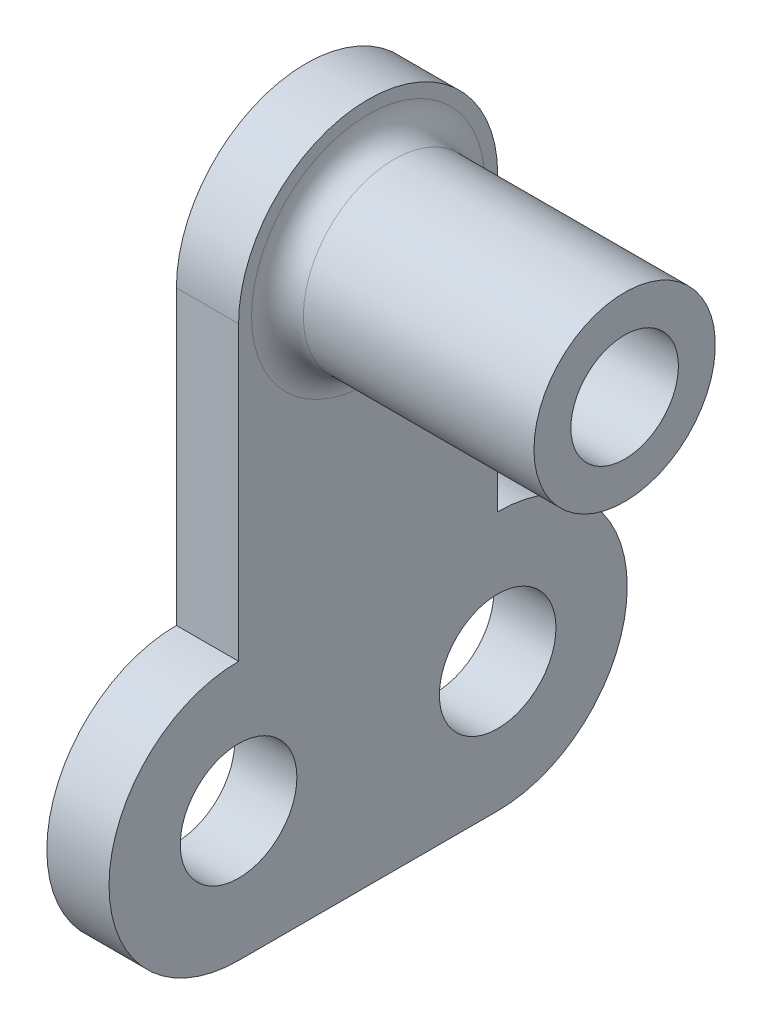
ISO-10303-21;
HEADER;
FILE_DESCRIPTION(('STEP AP214'),'2;1');
FILE_NAME('part.step','',(''),(''),'','','');
FILE_SCHEMA(('AUTOMOTIVE_DESIGN { 1 0 10303 214 1 1 1 1 }'));
ENDSEC;
DATA;
#1=APPLICATION_CONTEXT('core data for automotive mechanical design processes');
#2=APPLICATION_PROTOCOL_DEFINITION('international standard','automotive_design',2000,#1);
#3=PRODUCT_CONTEXT('',#1,'mechanical');
#4=PRODUCT('Part','Part','',(#3));
#5=PRODUCT_RELATED_PRODUCT_CATEGORY('part','',(#4));
#6=PRODUCT_DEFINITION_FORMATION('','',#4);
#7=PRODUCT_DEFINITION_CONTEXT('part definition',#1,'design');
#8=PRODUCT_DEFINITION('design','',#6,#7);
#9=PRODUCT_DEFINITION_SHAPE('','',#8);
#10=(LENGTH_UNIT() NAMED_UNIT(*) SI_UNIT(.MILLI.,.METRE.));
#11=(NAMED_UNIT(*) PLANE_ANGLE_UNIT() SI_UNIT($,.RADIAN.));
#12=(NAMED_UNIT(*) SI_UNIT($,.STERADIAN.) SOLID_ANGLE_UNIT());
#13=UNCERTAINTY_MEASURE_WITH_UNIT(LENGTH_MEASURE(1.E-05),#10,'distance_accuracy_value','');
#14=(GEOMETRIC_REPRESENTATION_CONTEXT(3) GLOBAL_UNCERTAINTY_ASSIGNED_CONTEXT((#13)) GLOBAL_UNIT_ASSIGNED_CONTEXT((#10,
#11,#12)) REPRESENTATION_CONTEXT('',''));
#15=CARTESIAN_POINT('',(0.,0.,0.));
#16=DIRECTION('',(0.,0.,1.));
#17=DIRECTION('',(1.,0.,0.));
#18=AXIS2_PLACEMENT_3D('',#15,#16,#17);
#19=CARTESIAN_POINT('',(2.4,21.2821563056051,0.));
#20=DIRECTION('',(-1.,0.,0.));
#21=DIRECTION('',(0.,0.,1.));
#22=AXIS2_PLACEMENT_3D('',#19,#20,#21);
#23=CYLINDRICAL_SURFACE('',#22,2.075);
#24=CARTESIAN_POINT('',(12.3,21.2821563056051,0.));
#25=DIRECTION('',(1.,0.,0.));
#26=DIRECTION('',(0.,0.,-1.));
#27=AXIS2_PLACEMENT_3D('',#24,#25,#26);
#28=CIRCLE('',#27,2.075);
#29=CARTESIAN_POINT('',(12.3,21.2821563056051,-2.075));
#30=VERTEX_POINT('',#29);
#31=EDGE_CURVE('E224',#30,#30,#28,.T.);
#32=ORIENTED_EDGE('',*,*,#31,.T.);
#33=EDGE_LOOP('',(#32));
#34=FACE_BOUND('',#33,.T.);
#35=CARTESIAN_POINT('',(4.,21.2821563056051,0.));
#36=DIRECTION('',(-1.,0.,0.));
#37=DIRECTION('',(0.,0.,1.));
#38=AXIS2_PLACEMENT_3D('',#35,#36,#37);
#39=CIRCLE('',#38,2.075);
#40=CARTESIAN_POINT('',(4.,21.2821563056051,2.075));
#41=VERTEX_POINT('',#40);
#42=EDGE_CURVE('E228',#41,#41,#39,.T.);
#43=ORIENTED_EDGE('',*,*,#42,.T.);
#44=EDGE_LOOP('',(#43));
#45=FACE_BOUND('',#44,.T.);
#46=ADVANCED_FACE('F41',(#34,#45),#23,.F.);
#47=CARTESIAN_POINT('',(2.4,5.,5.));
#48=DIRECTION('',(1.,0.,0.));
#49=DIRECTION('',(0.,0.,-1.));
#50=AXIS2_PLACEMENT_3D('',#47,#48,#49);
#51=PLANE('',#50);
#52=CARTESIAN_POINT('',(2.4,21.2821563056051,0.));
#53=DIRECTION('',(1.,0.,0.));
#54=DIRECTION('',(0.,0.,-1.));
#55=AXIS2_PLACEMENT_3D('',#52,#53,#54);
#56=CIRCLE('',#55,4.5);
#57=CARTESIAN_POINT('',(2.4,21.2821563056051,-4.5));
#58=VERTEX_POINT('',#57);
#59=EDGE_CURVE('E11',#58,#58,#56,.F.);
#60=ORIENTED_EDGE('',*,*,#59,.T.);
#61=EDGE_LOOP('',(#60));
#62=FACE_BOUND('',#61,.T.);
#63=CARTESIAN_POINT('',(2.4,5.,-5.));
#64=DIRECTION('',(1.,0.,0.));
#65=DIRECTION('',(0.,0.,-1.));
#66=AXIS2_PLACEMENT_3D('',#63,#64,#65);
#67=CIRCLE('',#66,2.25);
#68=CARTESIAN_POINT('',(2.4,5.,-7.25));
#69=VERTEX_POINT('',#68);
#70=EDGE_CURVE('E212',#69,#69,#67,.T.);
#71=ORIENTED_EDGE('',*,*,#70,.F.);
#72=EDGE_LOOP('',(#71));
#73=FACE_BOUND('',#72,.T.);
#74=CARTESIAN_POINT('',(2.4,5.,5.));
#75=DIRECTION('',(1.,0.,0.));
#76=DIRECTION('',(0.,0.,-1.));
#77=AXIS2_PLACEMENT_3D('',#74,#75,#76);
#78=CIRCLE('',#77,5.);
#79=CARTESIAN_POINT('',(2.4,10.,5.));
#80=VERTEX_POINT('',#79);
#81=CARTESIAN_POINT('',(2.4,0.,5.));
#82=VERTEX_POINT('',#81);
#83=EDGE_CURVE('E139',#80,#82,#78,.T.);
#84=ORIENTED_EDGE('',*,*,#83,.T.);
#85=DIRECTION('',(0.,0.,-1.));
#86=VECTOR('',#85,1.);
#87=CARTESIAN_POINT('',(2.4,0.,5.));
#88=LINE('',#87,#86);
#89=CARTESIAN_POINT('',(2.4,0.,-5.));
#90=VERTEX_POINT('',#89);
#91=EDGE_CURVE('E98',#82,#90,#88,.T.);
#92=ORIENTED_EDGE('',*,*,#91,.T.);
#93=CARTESIAN_POINT('',(2.4,5.,-5.));
#94=DIRECTION('',(1.,0.,0.));
#95=DIRECTION('',(0.,0.,-1.));
#96=AXIS2_PLACEMENT_3D('',#93,#94,#95);
#97=CIRCLE('',#96,5.);
#98=CARTESIAN_POINT('',(2.4,10.,-5.));
#99=VERTEX_POINT('',#98);
#100=EDGE_CURVE('E109',#90,#99,#97,.T.);
#101=ORIENTED_EDGE('',*,*,#100,.T.);
#102=DIRECTION('',(0.,1.,0.));
#103=VECTOR('',#102,1.);
#104=CARTESIAN_POINT('',(2.4,10.,-5.));
#105=LINE('',#104,#103);
#106=CARTESIAN_POINT('',(2.4,21.2821563056051,-5.));
#107=VERTEX_POINT('',#106);
#108=EDGE_CURVE('E101',#99,#107,#105,.T.);
#109=ORIENTED_EDGE('',*,*,#108,.T.);
#110=CARTESIAN_POINT('',(2.4,21.2821563056051,0.));
#111=DIRECTION('',(1.,0.,0.));
#112=DIRECTION('',(0.,0.,1.));
#113=AXIS2_PLACEMENT_3D('',#110,#111,#112);
#114=CIRCLE('',#113,5.);
#115=CARTESIAN_POINT('',(2.4,21.2821563056051,5.));
#116=VERTEX_POINT('',#115);
#117=EDGE_CURVE('E108',#107,#116,#114,.T.);
#118=ORIENTED_EDGE('',*,*,#117,.T.);
#119=DIRECTION('',(0.,-1.,0.));
#120=VECTOR('',#119,1.);
#121=CARTESIAN_POINT('',(2.4,10.,5.));
#122=LINE('',#121,#120);
#123=EDGE_CURVE('E59',#116,#80,#122,.T.);
#124=ORIENTED_EDGE('',*,*,#123,.T.);
#125=EDGE_LOOP('',(#84,#92,#101,#109,#118,#124));
#126=FACE_BOUND('',#125,.T.);
#127=CARTESIAN_POINT('',(2.4,5.,5.));
#128=DIRECTION('',(1.,0.,0.));
#129=DIRECTION('',(0.,0.,-1.));
#130=AXIS2_PLACEMENT_3D('',#127,#128,#129);
#131=CIRCLE('',#130,2.25);
#132=CARTESIAN_POINT('',(2.4,5.,2.75));
#133=VERTEX_POINT('',#132);
#134=EDGE_CURVE('E132',#133,#133,#131,.T.);
#135=ORIENTED_EDGE('',*,*,#134,.F.);
#136=EDGE_LOOP('',(#135));
#137=FACE_BOUND('',#136,.T.);
#138=ADVANCED_FACE('F102',(#62,#73,#126,#137),#51,.T.);
#139=CARTESIAN_POINT('',(0.,5.,5.));
#140=DIRECTION('',(1.,0.,0.));
#141=DIRECTION('',(0.,0.,-1.));
#142=AXIS2_PLACEMENT_3D('',#139,#140,#141);
#143=PLANE('',#142);
#144=CARTESIAN_POINT('',(0.,5.,5.));
#145=DIRECTION('',(1.,0.,0.));
#146=DIRECTION('',(0.,0.,-1.));
#147=AXIS2_PLACEMENT_3D('',#144,#145,#146);
#148=CIRCLE('',#147,5.);
#149=CARTESIAN_POINT('',(0.,10.,5.));
#150=VERTEX_POINT('',#149);
#151=CARTESIAN_POINT('',(0.,0.,5.));
#152=VERTEX_POINT('',#151);
#153=EDGE_CURVE('E127',#150,#152,#148,.T.);
#154=ORIENTED_EDGE('',*,*,#153,.F.);
#155=DIRECTION('',(0.,-1.,0.));
#156=VECTOR('',#155,1.);
#157=CARTESIAN_POINT('',(0.,10.,5.));
#158=LINE('',#157,#156);
#159=CARTESIAN_POINT('',(0.,21.2821563056051,5.));
#160=VERTEX_POINT('',#159);
#161=EDGE_CURVE('E87',#160,#150,#158,.T.);
#162=ORIENTED_EDGE('',*,*,#161,.F.);
#163=CARTESIAN_POINT('',(0.,21.2821563056051,0.));
#164=DIRECTION('',(1.,0.,0.));
#165=DIRECTION('',(0.,0.,1.));
#166=AXIS2_PLACEMENT_3D('',#163,#164,#165);
#167=CIRCLE('',#166,5.);
#168=CARTESIAN_POINT('',(0.,21.2821563056051,-5.));
#169=VERTEX_POINT('',#168);
#170=EDGE_CURVE('E83',#169,#160,#167,.T.);
#171=ORIENTED_EDGE('',*,*,#170,.F.);
#172=DIRECTION('',(0.,1.,0.));
#173=VECTOR('',#172,1.);
#174=CARTESIAN_POINT('',(0.,10.,-5.));
#175=LINE('',#174,#173);
#176=CARTESIAN_POINT('',(0.,10.,-5.));
#177=VERTEX_POINT('',#176);
#178=EDGE_CURVE('E117',#177,#169,#175,.T.);
#179=ORIENTED_EDGE('',*,*,#178,.F.);
#180=CARTESIAN_POINT('',(0.,5.,-5.));
#181=DIRECTION('',(1.,0.,0.));
#182=DIRECTION('',(0.,0.,-1.));
#183=AXIS2_PLACEMENT_3D('',#180,#181,#182);
#184=CIRCLE('',#183,5.);
#185=CARTESIAN_POINT('',(0.,0.,-5.));
#186=VERTEX_POINT('',#185);
#187=EDGE_CURVE('E133',#186,#177,#184,.T.);
#188=ORIENTED_EDGE('',*,*,#187,.F.);
#189=DIRECTION('',(0.,0.,-1.));
#190=VECTOR('',#189,1.);
#191=CARTESIAN_POINT('',(0.,0.,5.));
#192=LINE('',#191,#190);
#193=EDGE_CURVE('E131',#152,#186,#192,.T.);
#194=ORIENTED_EDGE('',*,*,#193,.F.);
#195=EDGE_LOOP('',(#154,#162,#171,#179,#188,#194));
#196=FACE_BOUND('',#195,.T.);
#197=CARTESIAN_POINT('',(0.,5.,5.));
#198=DIRECTION('',(1.,0.,0.));
#199=DIRECTION('',(0.,0.,-1.));
#200=AXIS2_PLACEMENT_3D('',#197,#198,#199);
#201=CIRCLE('',#200,2.25);
#202=CARTESIAN_POINT('',(0.,5.,2.75));
#203=VERTEX_POINT('',#202);
#204=EDGE_CURVE('E208',#203,#203,#201,.T.);
#205=ORIENTED_EDGE('',*,*,#204,.T.);
#206=EDGE_LOOP('',(#205));
#207=FACE_BOUND('',#206,.T.);
#208=CARTESIAN_POINT('',(0.,5.,-5.));
#209=DIRECTION('',(1.,0.,0.));
#210=DIRECTION('',(0.,0.,-1.));
#211=AXIS2_PLACEMENT_3D('',#208,#209,#210);
#212=CIRCLE('',#211,2.25);
#213=CARTESIAN_POINT('',(0.,5.,-7.25));
#214=VERTEX_POINT('',#213);
#215=EDGE_CURVE('E216',#214,#214,#212,.T.);
#216=ORIENTED_EDGE('',*,*,#215,.T.);
#217=EDGE_LOOP('',(#216));
#218=FACE_BOUND('',#217,.T.);
#219=CARTESIAN_POINT('',(0.,21.2821563056051,0.));
#220=DIRECTION('',(-1.,0.,0.));
#221=DIRECTION('',(0.,0.,1.));
#222=AXIS2_PLACEMENT_3D('',#219,#220,#221);
#223=CIRCLE('',#222,1.2);
#224=CARTESIAN_POINT('',(0.,21.2821563056051,1.2));
#225=VERTEX_POINT('',#224);
#226=EDGE_CURVE('E229',#225,#225,#223,.T.);
#227=ORIENTED_EDGE('',*,*,#226,.F.);
#228=EDGE_LOOP('',(#227));
#229=FACE_BOUND('',#228,.T.);
#230=ADVANCED_FACE('F173',(#196,#207,#218,#229),#143,.F.);
#231=CARTESIAN_POINT('',(2.4,5.,5.));
#232=DIRECTION('',(-1.,0.,0.));
#233=DIRECTION('',(0.,0.,1.));
#234=AXIS2_PLACEMENT_3D('',#231,#232,#233);
#235=CYLINDRICAL_SURFACE('',#234,5.);
#236=ORIENTED_EDGE('',*,*,#153,.T.);
#237=DIRECTION('',(-1.,0.,0.));
#238=VECTOR('',#237,1.);
#239=CARTESIAN_POINT('',(2.4,0.,5.));
#240=LINE('',#239,#238);
#241=EDGE_CURVE('E148',#82,#152,#240,.T.);
#242=ORIENTED_EDGE('',*,*,#241,.F.);
#243=ORIENTED_EDGE('',*,*,#83,.F.);
#244=DIRECTION('',(-1.,0.,0.));
#245=VECTOR('',#244,1.);
#246=CARTESIAN_POINT('',(2.4,10.,5.));
#247=LINE('',#246,#245);
#248=EDGE_CURVE('E121',#80,#150,#247,.T.);
#249=ORIENTED_EDGE('',*,*,#248,.T.);
#250=EDGE_LOOP('',(#236,#242,#243,#249));
#251=FACE_BOUND('',#250,.T.);
#252=ADVANCED_FACE('F182',(#251),#235,.T.);
#253=CARTESIAN_POINT('',(2.4,0.,5.));
#254=DIRECTION('',(0.,1.,0.));
#255=DIRECTION('',(0.,0.,1.));
#256=AXIS2_PLACEMENT_3D('',#253,#254,#255);
#257=PLANE('',#256);
#258=ORIENTED_EDGE('',*,*,#193,.T.);
#259=DIRECTION('',(-1.,0.,0.));
#260=VECTOR('',#259,1.);
#261=CARTESIAN_POINT('',(2.4,0.,-5.));
#262=LINE('',#261,#260);
#263=EDGE_CURVE('E141',#90,#186,#262,.T.);
#264=ORIENTED_EDGE('',*,*,#263,.F.);
#265=ORIENTED_EDGE('',*,*,#91,.F.);
#266=ORIENTED_EDGE('',*,*,#241,.T.);
#267=EDGE_LOOP('',(#258,#264,#265,#266));
#268=FACE_BOUND('',#267,.T.);
#269=ADVANCED_FACE('F191',(#268),#257,.F.);
#270=CARTESIAN_POINT('',(2.4,5.,-5.));
#271=DIRECTION('',(-1.,0.,0.));
#272=DIRECTION('',(0.,0.,1.));
#273=AXIS2_PLACEMENT_3D('',#270,#271,#272);
#274=CYLINDRICAL_SURFACE('',#273,5.);
#275=ORIENTED_EDGE('',*,*,#187,.T.);
#276=DIRECTION('',(-1.,0.,0.));
#277=VECTOR('',#276,1.);
#278=CARTESIAN_POINT('',(2.4,10.,-5.));
#279=LINE('',#278,#277);
#280=EDGE_CURVE('E118',#99,#177,#279,.T.);
#281=ORIENTED_EDGE('',*,*,#280,.F.);
#282=ORIENTED_EDGE('',*,*,#100,.F.);
#283=ORIENTED_EDGE('',*,*,#263,.T.);
#284=EDGE_LOOP('',(#275,#281,#282,#283));
#285=FACE_BOUND('',#284,.T.);
#286=ADVANCED_FACE('F194',(#285),#274,.T.);
#287=CARTESIAN_POINT('',(2.4,10.,-5.));
#288=DIRECTION('',(0.,0.,1.));
#289=DIRECTION('',(0.,-1.,0.));
#290=AXIS2_PLACEMENT_3D('',#287,#288,#289);
#291=PLANE('',#290);
#292=ORIENTED_EDGE('',*,*,#178,.T.);
#293=DIRECTION('',(-1.,0.,0.));
#294=VECTOR('',#293,1.);
#295=CARTESIAN_POINT('',(2.4,21.2821563056051,-5.));
#296=LINE('',#295,#294);
#297=EDGE_CURVE('E114',#107,#169,#296,.T.);
#298=ORIENTED_EDGE('',*,*,#297,.F.);
#299=ORIENTED_EDGE('',*,*,#108,.F.);
#300=ORIENTED_EDGE('',*,*,#280,.T.);
#301=EDGE_LOOP('',(#292,#298,#299,#300));
#302=FACE_BOUND('',#301,.T.);
#303=ADVANCED_FACE('F116',(#302),#291,.F.);
#304=CARTESIAN_POINT('',(2.4,21.2821563056051,0.));
#305=DIRECTION('',(-1.,0.,0.));
#306=DIRECTION('',(0.,0.,1.));
#307=AXIS2_PLACEMENT_3D('',#304,#305,#306);
#308=CYLINDRICAL_SURFACE('',#307,5.);
#309=ORIENTED_EDGE('',*,*,#170,.T.);
#310=DIRECTION('',(-1.,0.,0.));
#311=VECTOR('',#310,1.);
#312=CARTESIAN_POINT('',(2.4,21.2821563056051,5.));
#313=LINE('',#312,#311);
#314=EDGE_CURVE('E119',#116,#160,#313,.T.);
#315=ORIENTED_EDGE('',*,*,#314,.F.);
#316=ORIENTED_EDGE('',*,*,#117,.F.);
#317=ORIENTED_EDGE('',*,*,#297,.T.);
#318=EDGE_LOOP('',(#309,#315,#316,#317));
#319=FACE_BOUND('',#318,.T.);
#320=ADVANCED_FACE('F125',(#319),#308,.T.);
#321=CARTESIAN_POINT('',(2.4,10.,5.));
#322=DIRECTION('',(0.,0.,-1.));
#323=DIRECTION('',(0.,1.,0.));
#324=AXIS2_PLACEMENT_3D('',#321,#322,#323);
#325=PLANE('',#324);
#326=ORIENTED_EDGE('',*,*,#161,.T.);
#327=ORIENTED_EDGE('',*,*,#248,.F.);
#328=ORIENTED_EDGE('',*,*,#123,.F.);
#329=ORIENTED_EDGE('',*,*,#314,.T.);
#330=EDGE_LOOP('',(#326,#327,#328,#329));
#331=FACE_BOUND('',#330,.T.);
#332=ADVANCED_FACE('F184',(#331),#325,.F.);
#333=CARTESIAN_POINT('',(2.4,5.,5.));
#334=DIRECTION('',(-1.,0.,0.));
#335=DIRECTION('',(0.,0.,1.));
#336=AXIS2_PLACEMENT_3D('',#333,#334,#335);
#337=CYLINDRICAL_SURFACE('',#336,2.25);
#338=ORIENTED_EDGE('',*,*,#134,.T.);
#339=EDGE_LOOP('',(#338));
#340=FACE_BOUND('',#339,.T.);
#341=ORIENTED_EDGE('',*,*,#204,.F.);
#342=EDGE_LOOP('',(#341));
#343=FACE_BOUND('',#342,.T.);
#344=ADVANCED_FACE('F177',(#340,#343),#337,.F.);
#345=CARTESIAN_POINT('',(2.4,5.,-5.));
#346=DIRECTION('',(-1.,0.,0.));
#347=DIRECTION('',(0.,0.,1.));
#348=AXIS2_PLACEMENT_3D('',#345,#346,#347);
#349=CYLINDRICAL_SURFACE('',#348,2.25);
#350=ORIENTED_EDGE('',*,*,#70,.T.);
#351=EDGE_LOOP('',(#350));
#352=FACE_BOUND('',#351,.T.);
#353=ORIENTED_EDGE('',*,*,#215,.F.);
#354=EDGE_LOOP('',(#353));
#355=FACE_BOUND('',#354,.T.);
#356=ADVANCED_FACE('F246',(#352,#355),#349,.F.);
#357=CARTESIAN_POINT('',(12.3,21.2821563056051,0.));
#358=DIRECTION('',(1.,0.,0.));
#359=DIRECTION('',(0.,0.,-1.));
#360=AXIS2_PLACEMENT_3D('',#357,#358,#359);
#361=PLANE('',#360);
#362=CARTESIAN_POINT('',(12.3,21.2821563056051,0.));
#363=DIRECTION('',(1.,0.,0.));
#364=DIRECTION('',(0.,0.,-1.));
#365=AXIS2_PLACEMENT_3D('',#362,#363,#364);
#366=CIRCLE('',#365,3.5);
#367=CARTESIAN_POINT('',(12.3,21.2821563056051,3.5));
#368=VERTEX_POINT('',#367);
#369=EDGE_CURVE('E218',#368,#368,#366,.T.);
#370=ORIENTED_EDGE('',*,*,#369,.T.);
#371=EDGE_LOOP('',(#370));
#372=FACE_BOUND('',#371,.T.);
#373=ORIENTED_EDGE('',*,*,#31,.F.);
#374=EDGE_LOOP('',(#373));
#375=FACE_BOUND('',#374,.T.);
#376=ADVANCED_FACE('F165',(#372,#375),#361,.T.);
#377=CARTESIAN_POINT('',(12.3,21.2821563056051,0.));
#378=DIRECTION('',(-1.,0.,0.));
#379=DIRECTION('',(0.,0.,1.));
#380=AXIS2_PLACEMENT_3D('',#377,#378,#379);
#381=CYLINDRICAL_SURFACE('',#380,3.5);
#382=CARTESIAN_POINT('',(3.4,21.2821563056051,0.));
#383=DIRECTION('',(1.,0.,0.));
#384=DIRECTION('',(0.,0.,-1.));
#385=AXIS2_PLACEMENT_3D('',#382,#383,#384);
#386=CIRCLE('',#385,3.5);
#387=CARTESIAN_POINT('',(3.4,21.2821563056051,3.5));
#388=VERTEX_POINT('',#387);
#389=EDGE_CURVE('E49',#388,#388,#386,.T.);
#390=CARTESIAN_POINT('',(3.4,21.2821563056051,3.5));
#391=CARTESIAN_POINT('',(3.49270833333333,21.2821563056051,3.5));
#392=CARTESIAN_POINT('',(3.58541666666667,21.2821563056051,3.5));
#393=CARTESIAN_POINT('',(3.77083333333333,21.2821563056051,3.5));
#394=CARTESIAN_POINT('',(3.86354166666667,21.2821563056051,3.5));
#395=CARTESIAN_POINT('',(4.04895833333333,21.2821563056051,3.5));
#396=CARTESIAN_POINT('',(4.14166666666667,21.2821563056051,3.5));
#397=CARTESIAN_POINT('',(4.32708333333333,21.2821563056051,3.5));
#398=CARTESIAN_POINT('',(4.41979166666667,21.2821563056051,3.5));
#399=CARTESIAN_POINT('',(4.60520833333333,21.2821563056051,3.5));
#400=CARTESIAN_POINT('',(4.69791666666667,21.2821563056051,3.5));
#401=CARTESIAN_POINT('',(4.88333333333333,21.2821563056051,3.5));
#402=CARTESIAN_POINT('',(4.97604166666667,21.2821563056051,3.5));
#403=CARTESIAN_POINT('',(5.16145833333333,21.2821563056051,3.5));
#404=CARTESIAN_POINT('',(5.25416666666667,21.2821563056051,3.5));
#405=CARTESIAN_POINT('',(5.43958333333333,21.2821563056051,3.5));
#406=CARTESIAN_POINT('',(5.53229166666667,21.2821563056051,3.5));
#407=CARTESIAN_POINT('',(5.71770833333333,21.2821563056051,3.5));
#408=CARTESIAN_POINT('',(5.81041666666667,21.2821563056051,3.5));
#409=CARTESIAN_POINT('',(5.99583333333333,21.2821563056051,3.5));
#410=CARTESIAN_POINT('',(6.08854166666667,21.2821563056051,3.5));
#411=CARTESIAN_POINT('',(6.27395833333333,21.2821563056051,3.5));
#412=CARTESIAN_POINT('',(6.36666666666667,21.2821563056051,3.5));
#413=CARTESIAN_POINT('',(6.55208333333333,21.2821563056051,3.5));
#414=CARTESIAN_POINT('',(6.64479166666667,21.2821563056051,3.5));
#415=CARTESIAN_POINT('',(6.83020833333333,21.2821563056051,3.5));
#416=CARTESIAN_POINT('',(6.92291666666667,21.2821563056051,3.5));
#417=CARTESIAN_POINT('',(7.10833333333333,21.2821563056051,3.5));
#418=CARTESIAN_POINT('',(7.20104166666667,21.2821563056051,3.5));
#419=CARTESIAN_POINT('',(7.38645833333333,21.2821563056051,3.5));
#420=CARTESIAN_POINT('',(7.47916666666667,21.2821563056051,3.5));
#421=CARTESIAN_POINT('',(7.66458333333333,21.2821563056051,3.5));
#422=CARTESIAN_POINT('',(7.75729166666667,21.2821563056051,3.5));
#423=CARTESIAN_POINT('',(7.94270833333333,21.2821563056051,3.5));
#424=CARTESIAN_POINT('',(8.03541666666667,21.2821563056051,3.5));
#425=CARTESIAN_POINT('',(8.22083333333333,21.2821563056051,3.5));
#426=CARTESIAN_POINT('',(8.31354166666667,21.2821563056051,3.5));
#427=CARTESIAN_POINT('',(8.49895833333333,21.2821563056051,3.5));
#428=CARTESIAN_POINT('',(8.59166666666667,21.2821563056051,3.5));
#429=CARTESIAN_POINT('',(8.77708333333333,21.2821563056051,3.5));
#430=CARTESIAN_POINT('',(8.86979166666666,21.2821563056051,3.5));
#431=CARTESIAN_POINT('',(9.05520833333333,21.2821563056051,3.5));
#432=CARTESIAN_POINT('',(9.14791666666667,21.2821563056051,3.5));
#433=CARTESIAN_POINT('',(9.33333333333333,21.2821563056051,3.5));
#434=CARTESIAN_POINT('',(9.42604166666667,21.2821563056051,3.5));
#435=CARTESIAN_POINT('',(9.61145833333333,21.2821563056051,3.5));
#436=CARTESIAN_POINT('',(9.70416666666666,21.2821563056051,3.5));
#437=CARTESIAN_POINT('',(9.88958333333333,21.2821563056051,3.5));
#438=CARTESIAN_POINT('',(9.98229166666667,21.2821563056051,3.5));
#439=CARTESIAN_POINT('',(10.1677083333333,21.2821563056051,3.5));
#440=CARTESIAN_POINT('',(10.2604166666667,21.2821563056051,3.5));
#441=CARTESIAN_POINT('',(10.4458333333333,21.2821563056051,3.5));
#442=CARTESIAN_POINT('',(10.5385416666667,21.2821563056051,3.5));
#443=CARTESIAN_POINT('',(10.7239583333333,21.2821563056051,3.5));
#444=CARTESIAN_POINT('',(10.8166666666667,21.2821563056051,3.5));
#445=CARTESIAN_POINT('',(11.0020833333333,21.2821563056051,3.5));
#446=CARTESIAN_POINT('',(11.0947916666667,21.2821563056051,3.5));
#447=CARTESIAN_POINT('',(11.2802083333333,21.2821563056051,3.5));
#448=CARTESIAN_POINT('',(11.3729166666667,21.2821563056051,3.5));
#449=CARTESIAN_POINT('',(11.5583333333333,21.2821563056051,3.5));
#450=CARTESIAN_POINT('',(11.6510416666667,21.2821563056051,3.5));
#451=CARTESIAN_POINT('',(11.8364583333333,21.2821563056051,3.5));
#452=CARTESIAN_POINT('',(11.9291666666667,21.2821563056051,3.5));
#453=CARTESIAN_POINT('',(12.1145833333333,21.2821563056051,3.5));
#454=CARTESIAN_POINT('',(12.2072916666667,21.2821563056051,3.5));
#455=CARTESIAN_POINT('',(12.3,21.2821563056051,3.5));
#456=B_SPLINE_CURVE_WITH_KNOTS('',3,(#390,#391,#392,#393,#394,#395,#396,#397,#398,#399,#400,
#401,#402,#403,#404,#405,#406,#407,#408,#409,#410,#411,#412,#413,#414,#415,#416,#417,#418,#419,
#420,#421,#422,#423,#424,#425,#426,#427,#428,#429,#430,#431,#432,#433,#434,#435,#436,#437,#438,
#439,#440,#441,#442,#443,#444,#445,#446,#447,#448,#449,#450,#451,#452,#453,#454,#455),
.UNSPECIFIED.,.F.,.F.,(4,2,2,2,2,2,2,2,2,2,2,2,2,2,2,2,2,2,2,2,2,2,2,2,2,2,2,2,2,2,2,2,4),(0.,
0.278125000000001,0.556249999999999,0.834375,1.1125,1.390625,1.66875,1.946875,2.225,2.503125,
2.78125,3.059375,3.3375,3.615625,3.89375,4.171875,4.45,4.728125,5.00625,5.284375,5.5625,
5.840625,6.11875,6.396875,6.675,6.953125,7.23125,7.509375,7.7875,8.065625,8.34375,8.621875,8.9),.UNSPECIFIED.);
#457=EDGE_CURVE('BSEAM146',#388,#368,#456,.T.);
#458=ORIENTED_EDGE('',*,*,#389,.T.);
#459=ORIENTED_EDGE('',*,*,#369,.F.);
#460=ORIENTED_EDGE('',*,*,#457,.T.);
#461=ORIENTED_EDGE('',*,*,#457,.F.);
#462=EDGE_LOOP('',(#458,#460,#459,#461));
#463=FACE_BOUND('',#462,.T.);
#464=ADVANCED_FACE('F146',(#463),#381,.T.);
#465=CARTESIAN_POINT('',(3.4,21.2821563056051,0.));
#466=DIRECTION('',(1.,0.,0.));
#467=DIRECTION('',(0.,0.,-1.));
#468=AXIS2_PLACEMENT_3D('',#465,#466,#467);
#469=TOROIDAL_SURFACE('',#468,4.5,1.);
#470=ORIENTED_EDGE('',*,*,#59,.F.);
#471=EDGE_LOOP('',(#470));
#472=FACE_BOUND('',#471,.T.);
#473=ORIENTED_EDGE('',*,*,#389,.F.);
#474=EDGE_LOOP('',(#473));
#475=FACE_BOUND('',#474,.T.);
#476=ADVANCED_FACE('F43',(#472,#475),#469,.F.);
#477=CARTESIAN_POINT('',(4.,21.2821563056051,0.));
#478=DIRECTION('',(-1.,0.,0.));
#479=DIRECTION('',(0.,0.,1.));
#480=AXIS2_PLACEMENT_3D('',#477,#478,#479);
#481=PLANE('',#480);
#482=CARTESIAN_POINT('',(4.,21.2821563056051,0.));
#483=DIRECTION('',(-1.,0.,0.));
#484=DIRECTION('',(0.,0.,1.));
#485=AXIS2_PLACEMENT_3D('',#482,#483,#484);
#486=CIRCLE('',#485,1.2);
#487=CARTESIAN_POINT('',(4.,21.2821563056051,1.2));
#488=VERTEX_POINT('',#487);
#489=EDGE_CURVE('E230',#488,#488,#486,.T.);
#490=ORIENTED_EDGE('',*,*,#489,.T.);
#491=EDGE_LOOP('',(#490));
#492=FACE_BOUND('',#491,.T.);
#493=ORIENTED_EDGE('',*,*,#42,.F.);
#494=EDGE_LOOP('',(#493));
#495=FACE_BOUND('',#494,.T.);
#496=ADVANCED_FACE('F153',(#492,#495),#481,.F.);
#497=CARTESIAN_POINT('',(4.,21.2821563056051,0.));
#498=DIRECTION('',(-1.,0.,0.));
#499=DIRECTION('',(0.,0.,1.));
#500=AXIS2_PLACEMENT_3D('',#497,#498,#499);
#501=CYLINDRICAL_SURFACE('',#500,1.2);
#502=ORIENTED_EDGE('',*,*,#489,.F.);
#503=EDGE_LOOP('',(#502));
#504=FACE_BOUND('',#503,.T.);
#505=ORIENTED_EDGE('',*,*,#226,.T.);
#506=EDGE_LOOP('',(#505));
#507=FACE_BOUND('',#506,.T.);
#508=ADVANCED_FACE('F163',(#504,#507),#501,.F.);
#509=CLOSED_SHELL('',(#46,#138,#230,#252,#269,#286,#303,#320,#332,#344,#356,#376,#464,#476,#496,#508));
#510=MANIFOLD_SOLID_BREP('B2',#509);
#511=ADVANCED_BREP_SHAPE_REPRESENTATION('',(#18,#510),#14);
#512=SHAPE_DEFINITION_REPRESENTATION(#9,#511);
ENDSEC;
END-ISO-10303-21;
